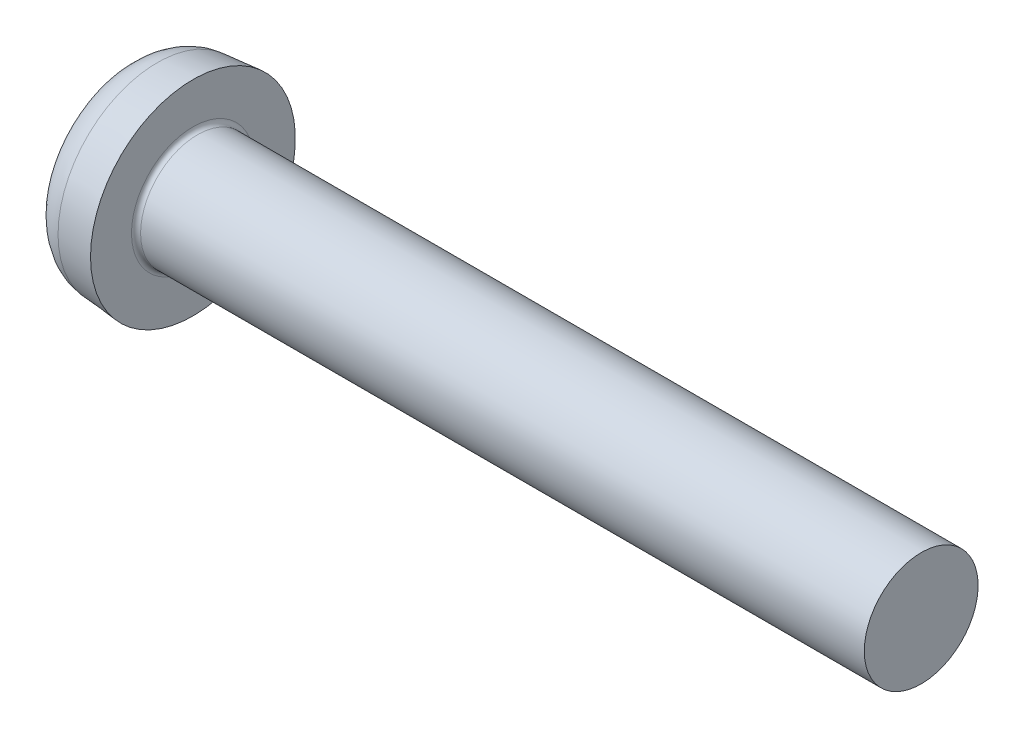
ISO-10303-21;
HEADER;
FILE_DESCRIPTION(('STEP AP214'),'2;1');
FILE_NAME('part.step','',(''),(''),'','','');
FILE_SCHEMA(('AUTOMOTIVE_DESIGN { 1 0 10303 214 1 1 1 1 }'));
ENDSEC;
DATA;
#1=APPLICATION_CONTEXT('core data for automotive mechanical design processes');
#2=APPLICATION_PROTOCOL_DEFINITION('international standard','automotive_design',2000,#1);
#3=PRODUCT_CONTEXT('',#1,'mechanical');
#4=PRODUCT('Part','Part','',(#3));
#5=PRODUCT_RELATED_PRODUCT_CATEGORY('part','',(#4));
#6=PRODUCT_DEFINITION_FORMATION('','',#4);
#7=PRODUCT_DEFINITION_CONTEXT('part definition',#1,'design');
#8=PRODUCT_DEFINITION('design','',#6,#7);
#9=PRODUCT_DEFINITION_SHAPE('','',#8);
#10=(LENGTH_UNIT() NAMED_UNIT(*) SI_UNIT(.MILLI.,.METRE.));
#11=(NAMED_UNIT(*) PLANE_ANGLE_UNIT() SI_UNIT($,.RADIAN.));
#12=(NAMED_UNIT(*) SI_UNIT($,.STERADIAN.) SOLID_ANGLE_UNIT());
#13=UNCERTAINTY_MEASURE_WITH_UNIT(LENGTH_MEASURE(1.E-05),#10,'distance_accuracy_value','');
#14=(GEOMETRIC_REPRESENTATION_CONTEXT(3) GLOBAL_UNCERTAINTY_ASSIGNED_CONTEXT((#13)) GLOBAL_UNIT_ASSIGNED_CONTEXT((#10,
#11,#12)) REPRESENTATION_CONTEXT('',''));
#15=CARTESIAN_POINT('',(0.,0.,0.));
#16=DIRECTION('',(0.,0.,1.));
#17=DIRECTION('',(1.,0.,0.));
#18=AXIS2_PLACEMENT_3D('',#15,#16,#17);
#19=CARTESIAN_POINT('',(6.,0.,0.));
#20=DIRECTION('',(-1.,0.,0.));
#21=DIRECTION('',(0.,1.,0.));
#22=AXIS2_PLACEMENT_3D('',#19,#20,#21);
#23=SPHERICAL_SURFACE('',#22,6.);
#24=CARTESIAN_POINT('',(0.216617065304916,0.,0.));
#25=DIRECTION('',(-1.,0.,0.));
#26=DIRECTION('',(0.,0.,1.));
#27=AXIS2_PLACEMENT_3D('',#24,#25,#26);
#28=CIRCLE('',#27,1.59764884460812);
#29=CARTESIAN_POINT('',(0.216617065304916,0.,1.59764884460812));
#30=VERTEX_POINT('',#29);
#31=EDGE_CURVE('E998',#30,#30,#28,.T.);
#32=ORIENTED_EDGE('',*,*,#31,.T.);
#33=EDGE_LOOP('',(#32));
#34=FACE_BOUND('',#33,.T.);
#35=CARTESIAN_POINT('',(0.0328405484677418,0.,0.));
#36=DIRECTION('',(1.,0.,0.));
#37=DIRECTION('',(0.,0.,-1.));
#38=AXIS2_PLACEMENT_3D('',#35,#36,#37);
#39=CIRCLE('',#38,0.626903565143175);
#40=CARTESIAN_POINT('',(0.0328405484677452,-0.285999999999998,-0.557863854349125));
#41=VERTEX_POINT('',#40);
#42=CARTESIAN_POINT('',(0.0328405484677418,-0.557863854349099,-0.286));
#43=VERTEX_POINT('',#42);
#44=EDGE_CURVE('E631',#41,#43,#39,.F.);
#45=ORIENTED_EDGE('',*,*,#44,.F.);
#46=CARTESIAN_POINT('',(6.,-0.286,0.));
#47=DIRECTION('',(0.,1.,0.));
#48=DIRECTION('',(0.,0.,1.));
#49=AXIS2_PLACEMENT_3D('',#46,#47,#48);
#50=CIRCLE('',#49,5.99317979039508);
#51=CARTESIAN_POINT('',(0.134965223247732,-0.285999999999995,-1.23270883321507));
#52=VERTEX_POINT('',#51);
#53=EDGE_CURVE('E540',#52,#41,#50,.T.);
#54=ORIENTED_EDGE('',*,*,#53,.F.);
#55=CARTESIAN_POINT('',(5.32455841873248,0.,1.35472645463164));
#56=DIRECTION('',(-0.446197753347361,0.,0.89493439139848));
#57=DIRECTION('',(0.89493439139848,0.,0.446197753347361));
#58=AXIS2_PLACEMENT_3D('',#55,#56,#57);
#59=CIRCLE('',#58,5.80590173043051);
#60=CARTESIAN_POINT('',(0.134965223247731,0.286000000000005,-1.23270883321507));
#61=VERTEX_POINT('',#60);
#62=EDGE_CURVE('E67',#61,#52,#59,.T.);
#63=ORIENTED_EDGE('',*,*,#62,.F.);
#64=CARTESIAN_POINT('',(6.,0.286,0.));
#65=DIRECTION('',(0.,-1.,0.));
#66=DIRECTION('',(0.,0.,-1.));
#67=AXIS2_PLACEMENT_3D('',#64,#65,#66);
#68=CIRCLE('',#67,5.99317979039508);
#69=CARTESIAN_POINT('',(0.0328405484677495,0.286000000000002,-0.557863854349123));
#70=VERTEX_POINT('',#69);
#71=EDGE_CURVE('E532',#70,#61,#68,.T.);
#72=ORIENTED_EDGE('',*,*,#71,.F.);
#73=CARTESIAN_POINT('',(0.0328405484677418,0.557863854349099,-0.286));
#74=VERTEX_POINT('',#73);
#75=EDGE_CURVE('E372',#74,#70,#39,.F.);
#76=ORIENTED_EDGE('',*,*,#75,.F.);
#77=CARTESIAN_POINT('',(6.,0.,-0.286));
#78=DIRECTION('',(0.,0.,1.));
#79=DIRECTION('',(1.,0.,0.));
#80=AXIS2_PLACEMENT_3D('',#77,#78,#79);
#81=CIRCLE('',#80,5.99317979039508);
#82=CARTESIAN_POINT('',(0.134965223247726,1.23270883321505,-0.286));
#83=VERTEX_POINT('',#82);
#84=EDGE_CURVE('E646',#83,#74,#81,.T.);
#85=ORIENTED_EDGE('',*,*,#84,.F.);
#86=CARTESIAN_POINT('',(5.32455841873181,-1.35472645463242,0.));
#87=DIRECTION('',(-0.44619775334751,-0.894934391398405,0.));
#88=DIRECTION('',(0.894934391398405,-0.44619775334751,0.));
#89=AXIS2_PLACEMENT_3D('',#86,#87,#88);
#90=CIRCLE('',#89,5.80590173043025);
#91=CARTESIAN_POINT('',(0.134965223247726,1.23270883321505,0.286));
#92=VERTEX_POINT('',#91);
#93=EDGE_CURVE('E647',#92,#83,#90,.T.);
#94=ORIENTED_EDGE('',*,*,#93,.F.);
#95=CARTESIAN_POINT('',(6.,0.,0.286));
#96=DIRECTION('',(0.,0.,-1.));
#97=DIRECTION('',(0.,1.,0.));
#98=AXIS2_PLACEMENT_3D('',#95,#96,#97);
#99=CIRCLE('',#98,5.99317979039508);
#100=CARTESIAN_POINT('',(0.0328405484677418,0.557863854349093,0.286));
#101=VERTEX_POINT('',#100);
#102=EDGE_CURVE('E83',#101,#92,#99,.T.);
#103=ORIENTED_EDGE('',*,*,#102,.F.);
#104=CARTESIAN_POINT('',(0.0328405484677453,0.285999999999998,0.557863854349125));
#105=VERTEX_POINT('',#104);
#106=EDGE_CURVE('E608',#105,#101,#39,.F.);
#107=ORIENTED_EDGE('',*,*,#106,.F.);
#108=CARTESIAN_POINT('',(0.134965223247726,0.285999999999996,1.23270883321505));
#109=VERTEX_POINT('',#108);
#110=EDGE_CURVE('E544',#109,#105,#68,.T.);
#111=ORIENTED_EDGE('',*,*,#110,.F.);
#112=CARTESIAN_POINT('',(5.32455841873181,0.,-1.35472645463242));
#113=DIRECTION('',(-0.44619775334751,0.,-0.894934391398405));
#114=DIRECTION('',(-0.894934391398405,0.,0.44619775334751));
#115=AXIS2_PLACEMENT_3D('',#112,#113,#114);
#116=CIRCLE('',#115,5.80590173043025);
#117=CARTESIAN_POINT('',(0.134965223247726,-0.286000000000004,1.23270883321505));
#118=VERTEX_POINT('',#117);
#119=EDGE_CURVE('E658',#118,#109,#116,.T.);
#120=ORIENTED_EDGE('',*,*,#119,.F.);
#121=CARTESIAN_POINT('',(0.0328405484677495,-0.286000000000002,0.557863854349123));
#122=VERTEX_POINT('',#121);
#123=EDGE_CURVE('E543',#122,#118,#50,.T.);
#124=ORIENTED_EDGE('',*,*,#123,.F.);
#125=CARTESIAN_POINT('',(0.0328405484677418,-0.557863854349093,0.286));
#126=VERTEX_POINT('',#125);
#127=EDGE_CURVE('E628',#126,#122,#39,.F.);
#128=ORIENTED_EDGE('',*,*,#127,.F.);
#129=CARTESIAN_POINT('',(0.134965223247732,-1.23270883321507,0.286));
#130=VERTEX_POINT('',#129);
#131=EDGE_CURVE('E654',#130,#126,#99,.T.);
#132=ORIENTED_EDGE('',*,*,#131,.F.);
#133=CARTESIAN_POINT('',(5.32455841873248,1.35472645463164,0.));
#134=DIRECTION('',(-0.446197753347361,0.89493439139848,0.));
#135=DIRECTION('',(-0.89493439139848,-0.446197753347361,0.));
#136=AXIS2_PLACEMENT_3D('',#133,#134,#135);
#137=CIRCLE('',#136,5.80590173043051);
#138=CARTESIAN_POINT('',(0.134965223247731,-1.23270883321507,-0.286000000000001));
#139=VERTEX_POINT('',#138);
#140=EDGE_CURVE('E645',#139,#130,#137,.T.);
#141=ORIENTED_EDGE('',*,*,#140,.F.);
#142=EDGE_CURVE('E643',#43,#139,#81,.T.);
#143=ORIENTED_EDGE('',*,*,#142,.F.);
#144=EDGE_LOOP('',(#45,#54,#63,#72,#76,#85,#94,#103,#107,#111,#120,#124,#128,#132,#141,#143));
#145=FACE_BOUND('',#144,.T.);
#146=ADVANCED_FACE('F57',(#34,#145),#23,.T.);
#147=CARTESIAN_POINT('',(1.42,-0.592014234961795,0.286));
#148=DIRECTION('',(0.,0.,-1.));
#149=DIRECTION('',(0.,1.,0.));
#150=AXIS2_PLACEMENT_3D('',#147,#148,#149);
#151=PLANE('',#150);
#152=ORIENTED_EDGE('',*,*,#131,.T.);
#153=CARTESIAN_POINT('',(0.0134231894228765,-0.559389252140658,0.286));
#154=CARTESIAN_POINT('',(0.208586671867994,-0.544054178483201,0.286));
#155=CARTESIAN_POINT('',(0.403741306465549,-0.528603248128147,0.286));
#156=CARTESIAN_POINT('',(0.794022911338964,-0.497362111208615,0.286));
#157=CARTESIAN_POINT('',(0.989149881680545,-0.481571905464199,0.286));
#158=CARTESIAN_POINT('',(1.262908756176,-0.459102975568251,0.286));
#159=CARTESIAN_POINT('',(1.34155602410101,-0.452611396372104,0.286));
#160=CARTESIAN_POINT('',(1.4202,-0.446079981944204,0.286));
#161=B_SPLINE_CURVE_WITH_KNOTS('',3,(#153,#154,#155,#156,#157,#158,#159,#160),.UNSPECIFIED.,.F.,
.F.,(4,2,2,4),(0.,0.587295491413197,1.17458956343331,1.41133370944541),.UNSPECIFIED.);
#162=CARTESIAN_POINT('',(1.42,-0.446096594800557,0.286));
#163=VERTEX_POINT('',#162);
#164=EDGE_CURVE('E632',#126,#163,#161,.T.);
#165=ORIENTED_EDGE('',*,*,#164,.T.);
#166=DIRECTION('',(0.,-1.,0.));
#167=VECTOR('',#166,1.);
#168=CARTESIAN_POINT('',(1.42,0.5920142349615,0.286));
#169=LINE('',#168,#167);
#170=CARTESIAN_POINT('',(1.42,-0.592014234961795,0.286));
#171=VERTEX_POINT('',#170);
#172=EDGE_CURVE('E421',#163,#171,#169,.T.);
#173=ORIENTED_EDGE('',*,*,#172,.T.);
#174=DIRECTION('',(0.89493439139848,0.446197753347361,0.));
#175=VECTOR('',#174,1.);
#176=CARTESIAN_POINT('',(0.,-1.3,0.286));
#177=LINE('',#176,#175);
#178=EDGE_CURVE('E556',#130,#171,#177,.T.);
#179=ORIENTED_EDGE('',*,*,#178,.F.);
#180=EDGE_LOOP('',(#152,#165,#173,#179));
#181=FACE_BOUND('',#180,.T.);
#182=ADVANCED_FACE('F187',(#181),#151,.T.);
#183=CARTESIAN_POINT('',(1.42,0.5920142349615,0.286));
#184=VERTEX_POINT('',#183);
#185=CARTESIAN_POINT('',(1.42,0.446096594800557,0.286));
#186=VERTEX_POINT('',#185);
#187=EDGE_CURVE('E575',#184,#186,#169,.T.);
#188=ORIENTED_EDGE('',*,*,#187,.T.);
#189=CARTESIAN_POINT('',(1.4202,0.446079981944204,0.286));
#190=CARTESIAN_POINT('',(1.25565332815935,0.459742524349761,0.286));
#191=CARTESIAN_POINT('',(1.09109258619469,0.473233943366425,0.286));
#192=CARTESIAN_POINT('',(0.76194844984459,0.499934489868489,0.286));
#193=CARTESIAN_POINT('',(0.597365055495757,0.513143617804851,0.286));
#194=CARTESIAN_POINT('',(0.292995452908973,0.537364853347432,0.286));
#195=CARTESIAN_POINT('',(0.15321171072308,0.548407948736398,0.286));
#196=CARTESIAN_POINT('',(0.0134231894228765,0.559389252140658,0.286));
#197=B_SPLINE_CURVE_WITH_KNOTS('',3,(#189,#190,#191,#192,#193,#194,#195,#196),.UNSPECIFIED.,.F.,
.F.,(4,2,2,4),(0.,0.495338424331856,0.990676057297016,1.41133372828471),.UNSPECIFIED.);
#198=EDGE_CURVE('E627',#186,#101,#197,.T.);
#199=ORIENTED_EDGE('',*,*,#198,.T.);
#200=ORIENTED_EDGE('',*,*,#102,.T.);
#201=DIRECTION('',(0.894934391398405,-0.44619775334751,0.));
#202=VECTOR('',#201,1.);
#203=CARTESIAN_POINT('',(0.,1.3,0.286));
#204=LINE('',#203,#202);
#205=EDGE_CURVE('E553',#92,#184,#204,.T.);
#206=ORIENTED_EDGE('',*,*,#205,.T.);
#207=EDGE_LOOP('',(#188,#199,#200,#206));
#208=FACE_BOUND('',#207,.T.);
#209=ADVANCED_FACE('F192',(#208),#151,.T.);
#210=CARTESIAN_POINT('',(1.42,0.5920142349615,-0.286));
#211=DIRECTION('',(0.,0.,1.));
#212=DIRECTION('',(1.,0.,0.));
#213=AXIS2_PLACEMENT_3D('',#210,#211,#212);
#214=PLANE('',#213);
#215=DIRECTION('',(0.,1.,0.));
#216=VECTOR('',#215,1.);
#217=CARTESIAN_POINT('',(1.42,0.5920142349615,-0.286));
#218=LINE('',#217,#216);
#219=CARTESIAN_POINT('',(1.42,-0.592014234961795,-0.286));
#220=VERTEX_POINT('',#219);
#221=CARTESIAN_POINT('',(1.42,-0.446096594800557,-0.286));
#222=VERTEX_POINT('',#221);
#223=EDGE_CURVE('E573',#220,#222,#218,.T.);
#224=ORIENTED_EDGE('',*,*,#223,.T.);
#225=CARTESIAN_POINT('',(1.4202,-0.446079981944204,-0.286));
#226=CARTESIAN_POINT('',(1.25565332815935,-0.459742524349761,-0.286));
#227=CARTESIAN_POINT('',(1.09109258619469,-0.473233943366426,-0.286));
#228=CARTESIAN_POINT('',(0.76194844984459,-0.499934489868489,-0.286));
#229=CARTESIAN_POINT('',(0.597365055495757,-0.513143617804851,-0.286));
#230=CARTESIAN_POINT('',(0.292995452908973,-0.537364853347432,-0.286));
#231=CARTESIAN_POINT('',(0.15321171072308,-0.548407948736398,-0.286));
#232=CARTESIAN_POINT('',(0.0134231894228765,-0.559389252140658,-0.286));
#233=B_SPLINE_CURVE_WITH_KNOTS('',3,(#225,#226,#227,#228,#229,#230,#231,#232),.UNSPECIFIED.,.F.,
.F.,(4,2,2,4),(0.,0.495338424331856,0.990676057297016,1.41133372828471),.UNSPECIFIED.);
#234=EDGE_CURVE('E636',#222,#43,#233,.T.);
#235=ORIENTED_EDGE('',*,*,#234,.T.);
#236=ORIENTED_EDGE('',*,*,#142,.T.);
#237=DIRECTION('',(0.89493439139848,0.446197753347361,0.));
#238=VECTOR('',#237,1.);
#239=CARTESIAN_POINT('',(0.,-1.3,-0.286));
#240=LINE('',#239,#238);
#241=EDGE_CURVE('E552',#139,#220,#240,.T.);
#242=ORIENTED_EDGE('',*,*,#241,.T.);
#243=EDGE_LOOP('',(#224,#235,#236,#242));
#244=FACE_BOUND('',#243,.T.);
#245=ADVANCED_FACE('F381',(#244),#214,.T.);
#246=ORIENTED_EDGE('',*,*,#84,.T.);
#247=CARTESIAN_POINT('',(0.0134231894228765,0.559389252140658,-0.286));
#248=CARTESIAN_POINT('',(0.208586671867994,0.544054178483201,-0.286));
#249=CARTESIAN_POINT('',(0.403741306465549,0.528603248128147,-0.286));
#250=CARTESIAN_POINT('',(0.794022911338964,0.497362111208615,-0.286));
#251=CARTESIAN_POINT('',(0.989149881680545,0.481571905464199,-0.286));
#252=CARTESIAN_POINT('',(1.262908756176,0.459102975568251,-0.286));
#253=CARTESIAN_POINT('',(1.34155602410101,0.452611396372104,-0.286));
#254=CARTESIAN_POINT('',(1.4202,0.446079981944204,-0.286));
#255=B_SPLINE_CURVE_WITH_KNOTS('',3,(#247,#248,#249,#250,#251,#252,#253,#254),.UNSPECIFIED.,.F.,
.F.,(4,2,2,4),(0.,0.587295491413197,1.17458956343331,1.41133370944541),.UNSPECIFIED.);
#256=CARTESIAN_POINT('',(1.42,0.446096594800557,-0.286));
#257=VERTEX_POINT('',#256);
#258=EDGE_CURVE('E369',#74,#257,#255,.T.);
#259=ORIENTED_EDGE('',*,*,#258,.T.);
#260=CARTESIAN_POINT('',(1.42,0.5920142349615,-0.286));
#261=VERTEX_POINT('',#260);
#262=EDGE_CURVE('E409',#257,#261,#218,.T.);
#263=ORIENTED_EDGE('',*,*,#262,.T.);
#264=DIRECTION('',(0.894934391398405,-0.44619775334751,0.));
#265=VECTOR('',#264,1.);
#266=CARTESIAN_POINT('',(0.,1.3,-0.286));
#267=LINE('',#266,#265);
#268=EDGE_CURVE('E550',#83,#261,#267,.T.);
#269=ORIENTED_EDGE('',*,*,#268,.F.);
#270=EDGE_LOOP('',(#246,#259,#263,#269));
#271=FACE_BOUND('',#270,.T.);
#272=ADVANCED_FACE('F224',(#271),#214,.T.);
#273=CARTESIAN_POINT('',(1.42,0.5920142349615,0.286));
#274=DIRECTION('',(1.,0.,0.));
#275=DIRECTION('',(0.,0.,-1.));
#276=AXIS2_PLACEMENT_3D('',#273,#274,#275);
#277=PLANE('',#276);
#278=CARTESIAN_POINT('',(1.42,0.,0.));
#279=DIRECTION('',(-1.,0.,0.));
#280=DIRECTION('',(0.,0.,1.));
#281=AXIS2_PLACEMENT_3D('',#278,#279,#280);
#282=CIRCLE('',#281,0.529903927040225);
#283=EDGE_CURVE('E584',#222,#163,#282,.T.);
#284=ORIENTED_EDGE('',*,*,#283,.F.);
#285=ORIENTED_EDGE('',*,*,#223,.F.);
#286=DIRECTION('',(0.,0.,-1.));
#287=VECTOR('',#286,1.);
#288=CARTESIAN_POINT('',(1.42,-0.592014234961795,0.286));
#289=LINE('',#288,#287);
#290=EDGE_CURVE('E440',#171,#220,#289,.T.);
#291=ORIENTED_EDGE('',*,*,#290,.F.);
#292=ORIENTED_EDGE('',*,*,#172,.F.);
#293=EDGE_LOOP('',(#284,#285,#291,#292));
#294=FACE_BOUND('',#293,.T.);
#295=ADVANCED_FACE('F219',(#294),#277,.F.);
#296=CARTESIAN_POINT('',(1.42,-0.286000000000002,0.446096594800556));
#297=VERTEX_POINT('',#296);
#298=CARTESIAN_POINT('',(1.42,0.285999999999998,0.446096594800581));
#299=VERTEX_POINT('',#298);
#300=EDGE_CURVE('E600',#297,#299,#282,.T.);
#301=ORIENTED_EDGE('',*,*,#300,.F.);
#302=DIRECTION('',(0.,0.,-1.));
#303=VECTOR('',#302,1.);
#304=CARTESIAN_POINT('',(1.42,-0.286000000000002,0.592014234961499));
#305=LINE('',#304,#303);
#306=CARTESIAN_POINT('',(1.42,-0.286000000000002,0.592014234961499));
#307=VERTEX_POINT('',#306);
#308=EDGE_CURVE('E61',#307,#297,#305,.T.);
#309=ORIENTED_EDGE('',*,*,#308,.F.);
#310=DIRECTION('',(0.,-1.,0.));
#311=VECTOR('',#310,1.);
#312=CARTESIAN_POINT('',(1.42,-0.286000000000002,0.592014234961499));
#313=LINE('',#312,#311);
#314=CARTESIAN_POINT('',(1.42,0.285999999999998,0.592014234961501));
#315=VERTEX_POINT('',#314);
#316=EDGE_CURVE('E513',#315,#307,#313,.T.);
#317=ORIENTED_EDGE('',*,*,#316,.F.);
#318=DIRECTION('',(0.,0.,1.));
#319=VECTOR('',#318,1.);
#320=CARTESIAN_POINT('',(1.42,0.285999999999998,0.592014234961501));
#321=LINE('',#320,#319);
#322=EDGE_CURVE('E298',#299,#315,#321,.T.);
#323=ORIENTED_EDGE('',*,*,#322,.F.);
#324=EDGE_LOOP('',(#301,#309,#317,#323));
#325=FACE_BOUND('',#324,.T.);
#326=ADVANCED_FACE('F223',(#325),#277,.F.);
#327=EDGE_CURVE('E578',#186,#257,#282,.T.);
#328=ORIENTED_EDGE('',*,*,#327,.F.);
#329=ORIENTED_EDGE('',*,*,#187,.F.);
#330=DIRECTION('',(0.,0.,1.));
#331=VECTOR('',#330,1.);
#332=CARTESIAN_POINT('',(1.42,0.5920142349615,0.286));
#333=LINE('',#332,#331);
#334=EDGE_CURVE('E563',#261,#184,#333,.T.);
#335=ORIENTED_EDGE('',*,*,#334,.F.);
#336=ORIENTED_EDGE('',*,*,#262,.F.);
#337=EDGE_LOOP('',(#328,#329,#335,#336));
#338=FACE_BOUND('',#337,.T.);
#339=ADVANCED_FACE('F576',(#338),#277,.F.);
#340=CARTESIAN_POINT('',(1.42,0.286000000000001,-0.446096594800556));
#341=VERTEX_POINT('',#340);
#342=CARTESIAN_POINT('',(1.42,-0.285999999999998,-0.446096594800558));
#343=VERTEX_POINT('',#342);
#344=EDGE_CURVE('E509',#341,#343,#282,.T.);
#345=ORIENTED_EDGE('',*,*,#344,.F.);
#346=CARTESIAN_POINT('',(1.42,0.286000000000002,-0.592014234961794));
#347=VERTEX_POINT('',#346);
#348=EDGE_CURVE('E506',#347,#341,#321,.T.);
#349=ORIENTED_EDGE('',*,*,#348,.F.);
#350=DIRECTION('',(0.,1.,0.));
#351=VECTOR('',#350,1.);
#352=CARTESIAN_POINT('',(1.42,-0.285999999999998,-0.592014234961796));
#353=LINE('',#352,#351);
#354=CARTESIAN_POINT('',(1.42,-0.285999999999998,-0.592014234961796));
#355=VERTEX_POINT('',#354);
#356=EDGE_CURVE('E507',#355,#347,#353,.T.);
#357=ORIENTED_EDGE('',*,*,#356,.F.);
#358=EDGE_CURVE('E371',#343,#355,#305,.T.);
#359=ORIENTED_EDGE('',*,*,#358,.F.);
#360=EDGE_LOOP('',(#345,#349,#357,#359));
#361=FACE_BOUND('',#360,.T.);
#362=ADVANCED_FACE('F226',(#361),#277,.F.);
#363=CARTESIAN_POINT('',(1.42,0.285999999999998,0.592014234961501));
#364=DIRECTION('',(0.,-1.,0.));
#365=DIRECTION('',(1.,0.,0.));
#366=AXIS2_PLACEMENT_3D('',#363,#364,#365);
#367=PLANE('',#366);
#368=ORIENTED_EDGE('',*,*,#348,.T.);
#369=CARTESIAN_POINT('',(1.4202,0.286000000000001,-0.446079981944203));
#370=CARTESIAN_POINT('',(1.25565332815935,0.286000000000001,-0.45974252434976));
#371=CARTESIAN_POINT('',(1.09109258619469,0.286000000000002,-0.473233943366425));
#372=CARTESIAN_POINT('',(0.76194844984459,0.286000000000002,-0.499934489868488));
#373=CARTESIAN_POINT('',(0.597365055495757,0.286000000000002,-0.51314361780485));
#374=CARTESIAN_POINT('',(0.292995452908973,0.286000000000002,-0.537364853347431));
#375=CARTESIAN_POINT('',(0.15321171072308,0.286000000000002,-0.548407948736398));
#376=CARTESIAN_POINT('',(0.0134231894228765,0.286000000000002,-0.559389252140657));
#377=B_SPLINE_CURVE_WITH_KNOTS('',3,(#369,#370,#371,#372,#373,#374,#375,#376),.UNSPECIFIED.,.F.,
.F.,(4,2,2,4),(0.,0.495338424331856,0.990676057297016,1.41133372828471),.UNSPECIFIED.);
#378=EDGE_CURVE('E368',#341,#70,#377,.T.);
#379=ORIENTED_EDGE('',*,*,#378,.T.);
#380=ORIENTED_EDGE('',*,*,#71,.T.);
#381=DIRECTION('',(0.89493439139848,0.,0.446197753347361));
#382=VECTOR('',#381,1.);
#383=CARTESIAN_POINT('',(0.,0.286000000000005,-1.3));
#384=LINE('',#383,#382);
#385=EDGE_CURVE('E518',#61,#347,#384,.T.);
#386=ORIENTED_EDGE('',*,*,#385,.T.);
#387=EDGE_LOOP('',(#368,#379,#380,#386));
#388=FACE_BOUND('',#387,.T.);
#389=ADVANCED_FACE('F309',(#388),#367,.T.);
#390=CARTESIAN_POINT('',(1.42,-0.285999999999998,-0.592014234961796));
#391=DIRECTION('',(0.,1.,0.));
#392=DIRECTION('',(0.,0.,1.));
#393=AXIS2_PLACEMENT_3D('',#390,#391,#392);
#394=PLANE('',#393);
#395=ORIENTED_EDGE('',*,*,#53,.T.);
#396=CARTESIAN_POINT('',(0.0134231894228765,-0.285999999999998,-0.559389252140659));
#397=CARTESIAN_POINT('',(0.208586671867994,-0.285999999999998,-0.544054178483201));
#398=CARTESIAN_POINT('',(0.403741306465549,-0.285999999999998,-0.528603248128148));
#399=CARTESIAN_POINT('',(0.794022911338964,-0.285999999999998,-0.497362111208616));
#400=CARTESIAN_POINT('',(0.989149881680545,-0.285999999999998,-0.4815719054642));
#401=CARTESIAN_POINT('',(1.262908756176,-0.285999999999998,-0.459102975568252));
#402=CARTESIAN_POINT('',(1.34155602410101,-0.285999999999998,-0.452611396372105));
#403=CARTESIAN_POINT('',(1.4202,-0.285999999999998,-0.446079981944205));
#404=B_SPLINE_CURVE_WITH_KNOTS('',3,(#396,#397,#398,#399,#400,#401,#402,#403),.UNSPECIFIED.,.F.,
.F.,(4,2,2,4),(0.,0.587295491413197,1.17458956343331,1.41133370944541),.UNSPECIFIED.);
#405=EDGE_CURVE('E635',#41,#343,#404,.T.);
#406=ORIENTED_EDGE('',*,*,#405,.T.);
#407=ORIENTED_EDGE('',*,*,#358,.T.);
#408=DIRECTION('',(0.89493439139848,0.,0.446197753347361));
#409=VECTOR('',#408,1.);
#410=CARTESIAN_POINT('',(0.,-0.285999999999995,-1.3));
#411=LINE('',#410,#409);
#412=EDGE_CURVE('E521',#52,#355,#411,.T.);
#413=ORIENTED_EDGE('',*,*,#412,.F.);
#414=EDGE_LOOP('',(#395,#406,#407,#413));
#415=FACE_BOUND('',#414,.T.);
#416=ADVANCED_FACE('F477',(#415),#394,.T.);
#417=ORIENTED_EDGE('',*,*,#308,.T.);
#418=CARTESIAN_POINT('',(1.4202,-0.286000000000002,0.446079981944203));
#419=CARTESIAN_POINT('',(1.25565332815935,-0.286000000000002,0.45974252434976));
#420=CARTESIAN_POINT('',(1.09109258619469,-0.286000000000002,0.473233943366424));
#421=CARTESIAN_POINT('',(0.76194844984459,-0.286000000000002,0.499934489868488));
#422=CARTESIAN_POINT('',(0.597365055495757,-0.286000000000002,0.51314361780485));
#423=CARTESIAN_POINT('',(0.292995452908973,-0.286000000000002,0.537364853347431));
#424=CARTESIAN_POINT('',(0.15321171072308,-0.286000000000002,0.548407948736397));
#425=CARTESIAN_POINT('',(0.0134231894228765,-0.286000000000002,0.559389252140657));
#426=B_SPLINE_CURVE_WITH_KNOTS('',3,(#418,#419,#420,#421,#422,#423,#424,#425),.UNSPECIFIED.,.F.,
.F.,(4,2,2,4),(0.,0.495338424331855,0.990676057297016,1.41133372828471),.UNSPECIFIED.);
#427=EDGE_CURVE('E630',#297,#122,#426,.T.);
#428=ORIENTED_EDGE('',*,*,#427,.T.);
#429=ORIENTED_EDGE('',*,*,#123,.T.);
#430=DIRECTION('',(0.894934391398405,0.,-0.44619775334751));
#431=VECTOR('',#430,1.);
#432=CARTESIAN_POINT('',(0.,-0.286000000000005,1.3));
#433=LINE('',#432,#431);
#434=EDGE_CURVE('E530',#118,#307,#433,.T.);
#435=ORIENTED_EDGE('',*,*,#434,.T.);
#436=EDGE_LOOP('',(#417,#428,#429,#435));
#437=FACE_BOUND('',#436,.T.);
#438=ADVANCED_FACE('F485',(#437),#394,.T.);
#439=ORIENTED_EDGE('',*,*,#110,.T.);
#440=CARTESIAN_POINT('',(0.0134231894228765,0.285999999999998,0.559389252140659));
#441=CARTESIAN_POINT('',(0.208586671867995,0.285999999999998,0.544054178483201));
#442=CARTESIAN_POINT('',(0.403741306465549,0.285999999999998,0.528603248128148));
#443=CARTESIAN_POINT('',(0.794022911338964,0.285999999999998,0.497362111208616));
#444=CARTESIAN_POINT('',(0.989149881680544,0.285999999999998,0.4815719054642));
#445=CARTESIAN_POINT('',(1.262908756176,0.285999999999998,0.459102975568252));
#446=CARTESIAN_POINT('',(1.34155602410101,0.285999999999998,0.452611396372105));
#447=CARTESIAN_POINT('',(1.4202,0.285999999999998,0.446079981944205));
#448=B_SPLINE_CURVE_WITH_KNOTS('',3,(#440,#441,#442,#443,#444,#445,#446,#447),.UNSPECIFIED.,.F.,
.F.,(4,2,2,4),(0.,0.587295491413197,1.17458956343331,1.41133370944541),.UNSPECIFIED.);
#449=EDGE_CURVE('E12',#105,#299,#448,.T.);
#450=ORIENTED_EDGE('',*,*,#449,.T.);
#451=ORIENTED_EDGE('',*,*,#322,.T.);
#452=DIRECTION('',(0.894934391398405,0.,-0.44619775334751));
#453=VECTOR('',#452,1.);
#454=CARTESIAN_POINT('',(0.,0.285999999999995,1.3));
#455=LINE('',#454,#453);
#456=EDGE_CURVE('E527',#109,#315,#455,.T.);
#457=ORIENTED_EDGE('',*,*,#456,.F.);
#458=EDGE_LOOP('',(#439,#450,#451,#457));
#459=FACE_BOUND('',#458,.T.);
#460=ADVANCED_FACE('F202',(#459),#367,.T.);
#461=CARTESIAN_POINT('',(17.7,1.25,0.));
#462=DIRECTION('',(-1.,0.,0.));
#463=DIRECTION('',(0.,0.,1.));
#464=AXIS2_PLACEMENT_3D('',#461,#462,#463);
#465=PLANE('',#464);
#466=CARTESIAN_POINT('',(17.7,0.,0.));
#467=DIRECTION('',(-1.,0.,0.));
#468=DIRECTION('',(0.,0.,1.));
#469=AXIS2_PLACEMENT_3D('',#466,#467,#468);
#470=CIRCLE('',#469,1.25);
#471=CARTESIAN_POINT('',(17.7,0.,1.25));
#472=VERTEX_POINT('',#471);
#473=EDGE_CURVE('E988',#472,#472,#470,.T.);
#474=ORIENTED_EDGE('',*,*,#473,.F.);
#475=EDGE_LOOP('',(#474));
#476=FACE_BOUND('',#475,.T.);
#477=ADVANCED_FACE('F198',(#476),#465,.F.);
#478=CARTESIAN_POINT('',(0.,0.,0.));
#479=DIRECTION('',(-1.,0.,0.));
#480=DIRECTION('',(0.,0.,1.));
#481=AXIS2_PLACEMENT_3D('',#478,#479,#480);
#482=CYLINDRICAL_SURFACE('',#481,1.25);
#483=CARTESIAN_POINT('',(1.8,0.,0.));
#484=DIRECTION('',(-1.,0.,0.));
#485=DIRECTION('',(0.,0.,1.));
#486=AXIS2_PLACEMENT_3D('',#483,#484,#485);
#487=CIRCLE('',#486,1.25);
#488=CARTESIAN_POINT('',(1.8,0.,1.25));
#489=VERTEX_POINT('',#488);
#490=EDGE_CURVE('E650',#489,#489,#487,.F.);
#491=ORIENTED_EDGE('',*,*,#490,.T.);
#492=EDGE_LOOP('',(#491));
#493=FACE_BOUND('',#492,.T.);
#494=ORIENTED_EDGE('',*,*,#473,.T.);
#495=EDGE_LOOP('',(#494));
#496=FACE_BOUND('',#495,.T.);
#497=ADVANCED_FACE('F201',(#493,#496),#482,.T.);
#498=CARTESIAN_POINT('',(1.7,1.25,0.));
#499=DIRECTION('',(-1.,0.,0.));
#500=DIRECTION('',(0.,0.,1.));
#501=AXIS2_PLACEMENT_3D('',#498,#499,#500);
#502=PLANE('',#501);
#503=CARTESIAN_POINT('',(1.7,0.,0.));
#504=DIRECTION('',(-1.,0.,0.));
#505=DIRECTION('',(0.,0.,1.));
#506=AXIS2_PLACEMENT_3D('',#503,#504,#505);
#507=CIRCLE('',#506,1.35);
#508=CARTESIAN_POINT('',(1.7,0.,1.35));
#509=VERTEX_POINT('',#508);
#510=EDGE_CURVE('E987',#509,#509,#507,.T.);
#511=ORIENTED_EDGE('',*,*,#510,.T.);
#512=EDGE_LOOP('',(#511));
#513=FACE_BOUND('',#512,.T.);
#514=CARTESIAN_POINT('',(1.7,0.,0.));
#515=DIRECTION('',(-1.,0.,0.));
#516=DIRECTION('',(0.,0.,1.));
#517=AXIS2_PLACEMENT_3D('',#514,#515,#516);
#518=CIRCLE('',#517,2.25);
#519=CARTESIAN_POINT('',(1.7,0.,2.25));
#520=VERTEX_POINT('',#519);
#521=EDGE_CURVE('E991',#520,#520,#518,.T.);
#522=ORIENTED_EDGE('',*,*,#521,.F.);
#523=EDGE_LOOP('',(#522));
#524=FACE_BOUND('',#523,.T.);
#525=ADVANCED_FACE('F206',(#513,#524),#502,.F.);
#526=CARTESIAN_POINT('',(1.7,0.,0.));
#527=DIRECTION('',(1.,0.,0.));
#528=DIRECTION('',(0.,0.,-1.));
#529=AXIS2_PLACEMENT_3D('',#526,#527,#528);
#530=CONICAL_SURFACE('',#529,2.25,0.08726646259971);
#531=CARTESIAN_POINT('',(0.918010195732806,0.,0.));
#532=DIRECTION('',(-1.,0.,0.));
#533=DIRECTION('',(0.,0.,1.));
#534=AXIS2_PLACEMENT_3D('',#531,#532,#533);
#535=CIRCLE('',#534,2.18158475713377);
#536=CARTESIAN_POINT('',(0.918010195732806,0.,2.18158475713377));
#537=VERTEX_POINT('',#536);
#538=EDGE_CURVE('E996',#537,#537,#535,.T.);
#539=ORIENTED_EDGE('',*,*,#538,.F.);
#540=EDGE_LOOP('',(#539));
#541=FACE_BOUND('',#540,.T.);
#542=ORIENTED_EDGE('',*,*,#521,.T.);
#543=EDGE_LOOP('',(#542));
#544=FACE_BOUND('',#543,.T.);
#545=ADVANCED_FACE('F210',(#541,#544),#530,.T.);
#546=CARTESIAN_POINT('',(0.987734789930927,0.,0.));
#547=DIRECTION('',(-1.,0.,0.));
#548=DIRECTION('',(0.,0.,1.));
#549=AXIS2_PLACEMENT_3D('',#546,#547,#548);
#550=TOROIDAL_SURFACE('',#549,1.38462899866037,0.8);
#551=ORIENTED_EDGE('',*,*,#31,.F.);
#552=EDGE_LOOP('',(#551));
#553=FACE_BOUND('',#552,.T.);
#554=ORIENTED_EDGE('',*,*,#538,.T.);
#555=EDGE_LOOP('',(#554));
#556=FACE_BOUND('',#555,.T.);
#557=ADVANCED_FACE('F214',(#553,#556),#550,.T.);
#558=CARTESIAN_POINT('',(1.8,0.,0.));
#559=DIRECTION('',(-1.,0.,0.));
#560=DIRECTION('',(0.,0.,1.));
#561=AXIS2_PLACEMENT_3D('',#558,#559,#560);
#562=TOROIDAL_SURFACE('',#561,1.35,0.1);
#563=ORIENTED_EDGE('',*,*,#490,.F.);
#564=EDGE_LOOP('',(#563));
#565=FACE_BOUND('',#564,.T.);
#566=ORIENTED_EDGE('',*,*,#510,.F.);
#567=EDGE_LOOP('',(#566));
#568=FACE_BOUND('',#567,.T.);
#569=ADVANCED_FACE('F59',(#565,#568),#562,.F.);
#570=CARTESIAN_POINT('',(0.,-1.3,-0.286));
#571=DIRECTION('',(-0.446197753347361,0.89493439139848,0.));
#572=DIRECTION('',(-0.89493439139848,-0.446197753347361,0.));
#573=AXIS2_PLACEMENT_3D('',#570,#571,#572);
#574=PLANE('',#573);
#575=ORIENTED_EDGE('',*,*,#140,.T.);
#576=ORIENTED_EDGE('',*,*,#178,.T.);
#577=ORIENTED_EDGE('',*,*,#290,.T.);
#578=ORIENTED_EDGE('',*,*,#241,.F.);
#579=EDGE_LOOP('',(#575,#576,#577,#578));
#580=FACE_BOUND('',#579,.T.);
#581=ADVANCED_FACE('F443',(#580),#574,.T.);
#582=CARTESIAN_POINT('',(1.42,0.5920142349615,0.286));
#583=DIRECTION('',(-0.44619775334751,-0.894934391398405,0.));
#584=DIRECTION('',(0.894934391398405,-0.44619775334751,0.));
#585=AXIS2_PLACEMENT_3D('',#582,#583,#584);
#586=PLANE('',#585);
#587=ORIENTED_EDGE('',*,*,#93,.T.);
#588=ORIENTED_EDGE('',*,*,#268,.T.);
#589=ORIENTED_EDGE('',*,*,#334,.T.);
#590=ORIENTED_EDGE('',*,*,#205,.F.);
#591=EDGE_LOOP('',(#587,#588,#589,#590));
#592=FACE_BOUND('',#591,.T.);
#593=ADVANCED_FACE('F227',(#592),#586,.T.);
#594=CARTESIAN_POINT('',(0.,0.286000000000005,-1.3));
#595=DIRECTION('',(-0.446197753347361,0.,0.89493439139848));
#596=DIRECTION('',(-0.89493439139848,0.,-0.446197753347361));
#597=AXIS2_PLACEMENT_3D('',#594,#595,#596);
#598=PLANE('',#597);
#599=ORIENTED_EDGE('',*,*,#62,.T.);
#600=ORIENTED_EDGE('',*,*,#412,.T.);
#601=ORIENTED_EDGE('',*,*,#356,.T.);
#602=ORIENTED_EDGE('',*,*,#385,.F.);
#603=EDGE_LOOP('',(#599,#600,#601,#602));
#604=FACE_BOUND('',#603,.T.);
#605=ADVANCED_FACE('F315',(#604),#598,.T.);
#606=CARTESIAN_POINT('',(1.42,-0.286000000000002,0.592014234961499));
#607=DIRECTION('',(-0.44619775334751,0.,-0.894934391398405));
#608=DIRECTION('',(0.894934391398405,0.,-0.44619775334751));
#609=AXIS2_PLACEMENT_3D('',#606,#607,#608);
#610=PLANE('',#609);
#611=ORIENTED_EDGE('',*,*,#119,.T.);
#612=ORIENTED_EDGE('',*,*,#456,.T.);
#613=ORIENTED_EDGE('',*,*,#316,.T.);
#614=ORIENTED_EDGE('',*,*,#434,.F.);
#615=EDGE_LOOP('',(#611,#612,#613,#614));
#616=FACE_BOUND('',#615,.T.);
#617=ADVANCED_FACE('F451',(#616),#610,.T.);
#618=CARTESIAN_POINT('',(1.42,0.,0.));
#619=DIRECTION('',(-1.,0.,0.));
#620=DIRECTION('',(0.,0.,1.));
#621=AXIS2_PLACEMENT_3D('',#618,#619,#620);
#622=CONICAL_SURFACE('',#621,0.529903927040225,0.069813170079766);
#623=ORIENTED_EDGE('',*,*,#75,.T.);
#624=ORIENTED_EDGE('',*,*,#378,.F.);
#625=EDGE_CURVE('E618',#257,#341,#282,.T.);
#626=ORIENTED_EDGE('',*,*,#625,.F.);
#627=ORIENTED_EDGE('',*,*,#258,.F.);
#628=EDGE_LOOP('',(#623,#624,#626,#627));
#629=FACE_BOUND('',#628,.T.);
#630=ADVANCED_FACE('F185',(#629),#622,.F.);
#631=EDGE_CURVE('E623',#343,#222,#282,.T.);
#632=ORIENTED_EDGE('',*,*,#631,.F.);
#633=ORIENTED_EDGE('',*,*,#405,.F.);
#634=ORIENTED_EDGE('',*,*,#44,.T.);
#635=ORIENTED_EDGE('',*,*,#234,.F.);
#636=EDGE_LOOP('',(#632,#633,#634,#635));
#637=FACE_BOUND('',#636,.T.);
#638=ADVANCED_FACE('F640',(#637),#622,.F.);
#639=ORIENTED_EDGE('',*,*,#127,.T.);
#640=ORIENTED_EDGE('',*,*,#427,.F.);
#641=EDGE_CURVE('E602',#163,#297,#282,.T.);
#642=ORIENTED_EDGE('',*,*,#641,.F.);
#643=ORIENTED_EDGE('',*,*,#164,.F.);
#644=EDGE_LOOP('',(#639,#640,#642,#643));
#645=FACE_BOUND('',#644,.T.);
#646=ADVANCED_FACE('F183',(#645),#622,.F.);
#647=EDGE_CURVE('E75',#299,#186,#282,.T.);
#648=ORIENTED_EDGE('',*,*,#647,.F.);
#649=ORIENTED_EDGE('',*,*,#449,.F.);
#650=ORIENTED_EDGE('',*,*,#106,.T.);
#651=ORIENTED_EDGE('',*,*,#198,.F.);
#652=EDGE_LOOP('',(#648,#649,#650,#651));
#653=FACE_BOUND('',#652,.T.);
#654=ADVANCED_FACE('F177',(#653),#622,.F.);
#655=CARTESIAN_POINT('',(1.59217622300653,0.,0.));
#656=DIRECTION('',(-1.,0.,0.));
#657=DIRECTION('',(0.,0.,1.));
#658=AXIS2_PLACEMENT_3D('',#655,#656,#657);
#659=CONICAL_SURFACE('',#658,0.,1.25663706143592);
#660=ORIENTED_EDGE('',*,*,#647,.T.);
#661=ORIENTED_EDGE('',*,*,#327,.T.);
#662=ORIENTED_EDGE('',*,*,#625,.T.);
#663=ORIENTED_EDGE('',*,*,#344,.T.);
#664=ORIENTED_EDGE('',*,*,#631,.T.);
#665=ORIENTED_EDGE('',*,*,#283,.T.);
#666=ORIENTED_EDGE('',*,*,#641,.T.);
#667=ORIENTED_EDGE('',*,*,#300,.T.);
#668=EDGE_LOOP('',(#660,#661,#662,#663,#664,#665,#666,#667));
#669=FACE_BOUND('',#668,.T.);
#670=CARTESIAN_POINT('',(1.59217622300653,0.,0.));
#671=VERTEX_POINT('',#670);
#672=VERTEX_LOOP('',#671);
#673=FACE_BOUND('',#672,.T.);
#674=ADVANCED_FACE('F175',(#669,#673),#659,.F.);
#675=CLOSED_SHELL('',(#146,#182,#209,#245,#272,#295,#326,#339,#362,#389,#416,#438,#460,#477,
#497,#525,#545,#557,#569,#581,#593,#605,#617,#630,#638,#646,#654,#674));
#676=MANIFOLD_SOLID_BREP('B2',#675);
#677=ADVANCED_BREP_SHAPE_REPRESENTATION('',(#18,#676),#14);
#678=SHAPE_DEFINITION_REPRESENTATION(#9,#677);
ENDSEC;
END-ISO-10303-21;
